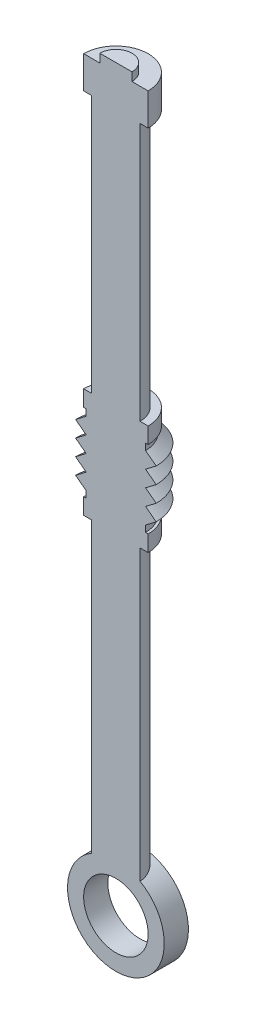
ISO-10303-21;
HEADER;
FILE_DESCRIPTION(('STEP AP214'),'2;1');
FILE_NAME('part.step','',(''),(''),'','','');
FILE_SCHEMA(('AUTOMOTIVE_DESIGN { 1 0 10303 214 1 1 1 1 }'));
ENDSEC;
DATA;
#1=APPLICATION_CONTEXT('core data for automotive mechanical design processes');
#2=APPLICATION_PROTOCOL_DEFINITION('international standard','automotive_design',2000,#1);
#3=PRODUCT_CONTEXT('',#1,'mechanical');
#4=PRODUCT('Part','Part','',(#3));
#5=PRODUCT_RELATED_PRODUCT_CATEGORY('part','',(#4));
#6=PRODUCT_DEFINITION_FORMATION('','',#4);
#7=PRODUCT_DEFINITION_CONTEXT('part definition',#1,'design');
#8=PRODUCT_DEFINITION('design','',#6,#7);
#9=PRODUCT_DEFINITION_SHAPE('','',#8);
#10=(LENGTH_UNIT() NAMED_UNIT(*) SI_UNIT(.MILLI.,.METRE.));
#11=(NAMED_UNIT(*) PLANE_ANGLE_UNIT() SI_UNIT($,.RADIAN.));
#12=(NAMED_UNIT(*) SI_UNIT($,.STERADIAN.) SOLID_ANGLE_UNIT());
#13=UNCERTAINTY_MEASURE_WITH_UNIT(LENGTH_MEASURE(1.E-05),#10,'distance_accuracy_value','');
#14=(GEOMETRIC_REPRESENTATION_CONTEXT(3) GLOBAL_UNCERTAINTY_ASSIGNED_CONTEXT((#13)) GLOBAL_UNIT_ASSIGNED_CONTEXT((#10,
#11,#12)) REPRESENTATION_CONTEXT('',''));
#15=CARTESIAN_POINT('',(0.,0.,0.));
#16=DIRECTION('',(0.,0.,1.));
#17=DIRECTION('',(1.,0.,0.));
#18=AXIS2_PLACEMENT_3D('',#15,#16,#17);
#19=CARTESIAN_POINT('',(0.,0.,-2.38125));
#20=DIRECTION('',(0.,0.,1.));
#21=DIRECTION('',(1.,0.,0.));
#22=AXIS2_PLACEMENT_3D('',#19,#20,#21);
#23=CYLINDRICAL_SURFACE('',#22,4.7625);
#24=CARTESIAN_POINT('',(0.,4.7625,2.38125));
#25=CARTESIAN_POINT('',(-0.125183914923426,4.76249216616824,2.38124079022415));
#26=CARTESIAN_POINT('',(-0.250522391801445,4.75751079676351,2.37131965241024));
#27=CARTESIAN_POINT('',(-0.497492135528296,4.73807236179371,2.33207069034315));
#28=CARTESIAN_POINT('',(-0.61911590225731,4.72359730146256,2.30270601091892));
#29=CARTESIAN_POINT('',(-0.854710283828683,4.68668758103659,2.2260071468603));
#30=CARTESIAN_POINT('',(-0.968708640458038,4.66428387601664,2.17874279663695));
#31=CARTESIAN_POINT('',(-1.18698797780686,4.6135713226785,2.06794748374516));
#32=CARTESIAN_POINT('',(-1.29126972381591,4.58526293998811,2.0044178036293));
#33=CARTESIAN_POINT('',(-1.49425297381025,4.52333339410727,1.8585245421104));
#34=CARTESIAN_POINT('',(-1.59223521685329,4.48949442770284,1.77525406928113));
#35=CARTESIAN_POINT('',(-1.77350605772424,4.42102804302336,1.59419572957401));
#36=CARTESIAN_POINT('',(-1.85678345855757,4.3864000463997,1.49639690352979));
#37=CARTESIAN_POINT('',(-2.01275632468803,4.31718127493204,1.27996152334087));
#38=CARTESIAN_POINT('',(-2.08413032991234,4.2828016396047,1.16029716565166));
#39=CARTESIAN_POINT('',(-2.2054380906532,4.22162236963736,0.90876278134485));
#40=CARTESIAN_POINT('',(-2.25538716198478,4.19481732492304,0.776901556021107));
#41=CARTESIAN_POINT('',(-2.32917787787114,4.1542779588081,0.512766217674418));
#42=CARTESIAN_POINT('',(-2.35440344714868,4.13985721707925,0.380989398503949));
#43=CARTESIAN_POINT('',(-2.38226677784078,4.12389375440723,0.114350392548179));
#44=CARTESIAN_POINT('',(-2.38492686044446,4.12233830748904,-0.0205086129467756));
#45=CARTESIAN_POINT('',(-2.36859910257368,4.13172902674897,-0.272143595403314));
#46=CARTESIAN_POINT('',(-2.35216198239562,4.14120243470123,-0.389153474350517));
#47=CARTESIAN_POINT('',(-2.30252551556825,4.16900269672528,-0.618462796693928));
#48=CARTESIAN_POINT('',(-2.26932082940667,4.1873323709318,-0.730760727258112));
#49=CARTESIAN_POINT('',(-2.18648703954377,4.23118303207826,-0.95066437192215));
#50=CARTESIAN_POINT('',(-2.13649337856986,4.25686158081143,-1.05809986210871));
#51=CARTESIAN_POINT('',(-2.02178051875954,4.31252481445096,-1.26357290922991));
#52=CARTESIAN_POINT('',(-1.95705470557847,4.3425114313283,-1.3616062166477));
#53=CARTESIAN_POINT('',(-1.80514479326104,4.40800707257198,-1.55857873309482));
#54=CARTESIAN_POINT('',(-1.71615367899184,4.44373421251251,-1.65605668020323));
#55=CARTESIAN_POINT('',(-1.5229417218779,4.51360277984095,-1.83531371551958));
#56=CARTESIAN_POINT('',(-1.41871364221752,4.54774344351895,-1.91708530103068));
#57=CARTESIAN_POINT('',(-1.19185492951209,4.61252857217558,-2.06617648032704));
#58=CARTESIAN_POINT('',(-1.06859448999609,4.6429370603578,-2.13264862501142));
#59=CARTESIAN_POINT('',(-0.810735175632698,4.69482204419958,-2.24336855040867));
#60=CARTESIAN_POINT('',(-0.676145403481687,4.71630562984336,-2.28763397806736));
#61=CARTESIAN_POINT('',(-0.411400208267049,4.74641069721793,-2.34904455510034));
#62=CARTESIAN_POINT('',(-0.281800769618209,4.75595009329994,-2.36813225512202));
#63=CARTESIAN_POINT('',(-0.0209064223793881,4.7642386329949,-2.384737891014));
#64=CARTESIAN_POINT('',(0.110387653565244,4.7629928883014,-2.38226604517899));
#65=CARTESIAN_POINT('',(0.360123514541608,4.75038401553492,-2.35694532320286));
#66=CARTESIAN_POINT('',(0.478772715418814,4.73981253794951,-2.33569065643669));
#67=CARTESIAN_POINT('',(0.710581412294078,4.71064045443463,-2.27590809129975));
#68=CARTESIAN_POINT('',(0.823740301552203,4.69203896333817,-2.23737828863266));
#69=CARTESIAN_POINT('',(1.04510349887023,4.64782498678607,-2.14312865180629));
#70=CARTESIAN_POINT('',(1.15307363286889,4.62202724713937,-2.08694881191042));
#71=CARTESIAN_POINT('',(1.35841111754757,4.56590338843347,-1.95951268074179));
#72=CARTESIAN_POINT('',(1.45577392465991,4.53557534193758,-1.88824996699537));
#73=CARTESIAN_POINT('',(1.64727181011511,4.46980202056836,-1.72459548718051));
#74=CARTESIAN_POINT('',(1.7401510102877,4.4341466953364,-1.63081604451219));
#75=CARTESIAN_POINT('',(1.90942036468315,4.36393570018444,-1.42892823352271));
#76=CARTESIAN_POINT('',(1.98579911229707,4.32938080496145,-1.32081003575388));
#77=CARTESIAN_POINT('',(2.12337947127906,4.2636565144193,-1.0866985484896));
#78=CARTESIAN_POINT('',(2.18366696159152,4.23273211084819,-0.960093172570528));
#79=CARTESIAN_POINT('',(2.28143472953946,4.18085759649541,-0.696491651629047));
#80=CARTESIAN_POINT('',(2.3189443944635,4.15989464137303,-0.559509152757374));
#81=CARTESIAN_POINT('',(2.36663314232661,4.13293324320619,-0.29310753161418));
#82=CARTESIAN_POINT('',(2.37909019428893,4.12569144386626,-0.164224683502319));
#83=CARTESIAN_POINT('',(2.3828910522584,4.12350000729882,0.0939333281807322));
#84=CARTESIAN_POINT('',(2.37424400991589,4.12854504196533,0.223208297429794));
#85=CARTESIAN_POINT('',(2.33821157512933,4.14903909044237,0.465495089724903));
#86=CARTESIAN_POINT('',(2.31268975773311,4.16345118862044,0.578883000588989));
#87=CARTESIAN_POINT('',(2.24593636258125,4.19983482171594,0.799643078320496));
#88=CARTESIAN_POINT('',(2.20469973139119,4.22180878809312,0.907013297317141));
#89=CARTESIAN_POINT('',(2.10458608148048,4.27264188427817,1.12067545046553));
#90=CARTESIAN_POINT('',(2.04471002356456,4.30186440868521,1.2264102837776));
#91=CARTESIAN_POINT('',(1.91012262489561,4.36329131541278,1.42702239668615));
#92=CARTESIAN_POINT('',(1.83540356597009,4.39549724439656,1.52189398690387));
#93=CARTESIAN_POINT('',(1.66259405491127,4.46394665051477,1.71007598397153));
#94=CARTESIAN_POINT('',(1.56276696401922,4.50020523168019,1.80179601937323));
#95=CARTESIAN_POINT('',(1.34816645613201,4.56908865882827,1.96753719658021));
#96=CARTESIAN_POINT('',(1.23338503411081,4.60171154114937,2.0415487984721));
#97=CARTESIAN_POINT('',(0.990398154568059,4.66006004858537,2.16988737295861));
#98=CARTESIAN_POINT('',(0.862103521645129,4.68573527644208,2.22407146731469));
#99=CARTESIAN_POINT('',(0.663253095567626,4.71657007779491,2.28808012549976));
#100=CARTESIAN_POINT('',(0.595951068853118,4.72556504162985,2.30653151659672));
#101=CARTESIAN_POINT('',(0.459699357941892,4.74075563729533,2.33749781582299));
#102=CARTESIAN_POINT('',(0.390750707345512,4.74695297899059,2.35001635025922));
#103=CARTESIAN_POINT('',(0.268146547102141,4.75524386229739,2.36671244235111));
#104=CARTESIAN_POINT('',(0.21470159582656,4.75795932264298,2.37215832704609));
#105=CARTESIAN_POINT('',(0.107513940854614,4.761589098815,2.37942913381609));
#106=CARTESIAN_POINT('',(0.0537712289809023,4.76250336492721,2.38125395594727));
#107=CARTESIAN_POINT('',(0.,4.7625,2.38125));
#108=B_SPLINE_CURVE_WITH_KNOTS('',3,(#24,#25,#26,#27,#28,#29,#30,#31,#32,#33,#34,#35,#36,#37,
#38,#39,#40,#41,#42,#43,#44,#45,#46,#47,#48,#49,#50,#51,#52,#53,#54,#55,#56,#57,#58,#59,#60,#61,
#62,#63,#64,#65,#66,#67,#68,#69,#70,#71,#72,#73,#74,#75,#76,#77,#78,#79,#80,#81,#82,#83,#84,#85,
#86,#87,#88,#89,#90,#91,#92,#93,#94,#95,#96,#97,#98,#99,#100,#101,#102,#103,#104,#105,#106,
#107),.UNSPECIFIED.,.T.,.F.,(4,2,2,2,2,2,2,2,2,2,2,2,2,2,2,2,2,2,2,2,2,2,2,2,2,2,2,2,2,2,2,2,2,
2,2,2,2,2,2,2,2,4),(0.,0.375342762982071,0.751399031495027,1.12600300776604,1.50057745488486,
1.89781281294745,2.29534935341367,2.7237148606323,3.15177363432781,3.55420641408922,
3.9562410713973,4.31019852674695,4.66426876848022,5.0265863440121,5.38906691250903,
5.79750891551298,6.20614554263122,6.63375821648137,7.06103054022366,7.45291460434892,
7.84461294242952,8.20595196117703,8.56733082133655,8.93904238416433,9.31091254594483,
9.71930072847022,10.127970328905,10.5564308689761,10.984337440701,11.3711666349163,
11.7578281130277,12.1076544640509,12.4575934042726,12.8310431270806,13.2046875497327,
13.6237323431551,14.0430023792659,14.4652368253627,14.6760580296016,14.8867502080478,
15.0479696796956,15.2091936010515),.UNSPECIFIED.);
#109=CARTESIAN_POINT('',(0.,4.7625,-2.38125));
#110=VERTEX_POINT('',#109);
#111=CARTESIAN_POINT('',(2.38125,4.12444598552338,0.));
#112=VERTEX_POINT('',#111);
#113=EDGE_CURVE('E269',#110,#112,#108,.T.);
#114=ORIENTED_EDGE('',*,*,#113,.T.);
#115=CARTESIAN_POINT('',(0.,0.,0.));
#116=DIRECTION('',(0.,0.,1.));
#117=DIRECTION('',(1.,0.,0.));
#118=AXIS2_PLACEMENT_3D('',#115,#116,#117);
#119=CIRCLE('',#118,4.7625);
#120=CARTESIAN_POINT('',(-2.38125,4.12444598552338,0.));
#121=VERTEX_POINT('',#120);
#122=EDGE_CURVE('E382',#112,#121,#119,.F.);
#123=ORIENTED_EDGE('',*,*,#122,.T.);
#124=EDGE_CURVE('E54',#121,#110,#108,.T.);
#125=ORIENTED_EDGE('',*,*,#124,.T.);
#126=CARTESIAN_POINT('',(0.,0.,-2.38125));
#127=DIRECTION('',(0.,0.,1.));
#128=DIRECTION('',(1.,0.,0.));
#129=AXIS2_PLACEMENT_3D('',#126,#127,#128);
#130=CIRCLE('',#129,4.7625);
#131=EDGE_CURVE('E40',#110,#110,#130,.T.);
#132=ORIENTED_EDGE('',*,*,#131,.T.);
#133=EDGE_LOOP('',(#114,#123,#125,#132));
#134=FACE_BOUND('',#133,.T.);
#135=ADVANCED_FACE('F33',(#134),#23,.T.);
#136=CARTESIAN_POINT('',(0.,0.,-2.38125));
#137=DIRECTION('',(0.,0.,1.));
#138=DIRECTION('',(1.,0.,0.));
#139=AXIS2_PLACEMENT_3D('',#136,#137,#138);
#140=CYLINDRICAL_SURFACE('',#139,3.175);
#141=CARTESIAN_POINT('',(0.,0.,-2.38125));
#142=DIRECTION('',(0.,0.,1.));
#143=DIRECTION('',(1.,0.,0.));
#144=AXIS2_PLACEMENT_3D('',#141,#142,#143);
#145=CIRCLE('',#144,3.175);
#146=CARTESIAN_POINT('',(3.175,0.,-2.38125));
#147=VERTEX_POINT('',#146);
#148=EDGE_CURVE('E276',#147,#147,#145,.T.);
#149=CARTESIAN_POINT('',(0.,0.,0.));
#150=DIRECTION('',(0.,0.,1.));
#151=DIRECTION('',(1.,0.,0.));
#152=AXIS2_PLACEMENT_3D('',#149,#150,#151);
#153=CIRCLE('',#152,3.175);
#154=CARTESIAN_POINT('',(3.175,0.,0.));
#155=VERTEX_POINT('',#154);
#156=EDGE_CURVE('E210',#155,#155,#153,.F.);
#157=CARTESIAN_POINT('',(3.175,0.,-2.38125));
#158=CARTESIAN_POINT('',(3.175,0.,-2.3564453125));
#159=CARTESIAN_POINT('',(3.175,0.,-2.331640625));
#160=CARTESIAN_POINT('',(3.175,0.,-2.28203125));
#161=CARTESIAN_POINT('',(3.175,0.,-2.2572265625));
#162=CARTESIAN_POINT('',(3.175,0.,-2.2076171875));
#163=CARTESIAN_POINT('',(3.175,0.,-2.1828125));
#164=CARTESIAN_POINT('',(3.175,0.,-2.133203125));
#165=CARTESIAN_POINT('',(3.175,0.,-2.1083984375));
#166=CARTESIAN_POINT('',(3.175,0.,-2.0587890625));
#167=CARTESIAN_POINT('',(3.175,0.,-2.033984375));
#168=CARTESIAN_POINT('',(3.175,0.,-1.984375));
#169=CARTESIAN_POINT('',(3.175,0.,-1.9595703125));
#170=CARTESIAN_POINT('',(3.175,0.,-1.9099609375));
#171=CARTESIAN_POINT('',(3.175,0.,-1.88515625));
#172=CARTESIAN_POINT('',(3.175,0.,-1.835546875));
#173=CARTESIAN_POINT('',(3.175,0.,-1.8107421875));
#174=CARTESIAN_POINT('',(3.175,0.,-1.7611328125));
#175=CARTESIAN_POINT('',(3.175,0.,-1.736328125));
#176=CARTESIAN_POINT('',(3.175,0.,-1.68671875));
#177=CARTESIAN_POINT('',(3.175,0.,-1.6619140625));
#178=CARTESIAN_POINT('',(3.175,0.,-1.6123046875));
#179=CARTESIAN_POINT('',(3.175,0.,-1.5875));
#180=CARTESIAN_POINT('',(3.175,0.,-1.537890625));
#181=CARTESIAN_POINT('',(3.175,0.,-1.5130859375));
#182=CARTESIAN_POINT('',(3.175,0.,-1.4634765625));
#183=CARTESIAN_POINT('',(3.175,0.,-1.438671875));
#184=CARTESIAN_POINT('',(3.175,0.,-1.3890625));
#185=CARTESIAN_POINT('',(3.175,0.,-1.3642578125));
#186=CARTESIAN_POINT('',(3.175,0.,-1.3146484375));
#187=CARTESIAN_POINT('',(3.175,0.,-1.28984375));
#188=CARTESIAN_POINT('',(3.175,0.,-1.240234375));
#189=CARTESIAN_POINT('',(3.175,0.,-1.2154296875));
#190=CARTESIAN_POINT('',(3.175,0.,-1.1658203125));
#191=CARTESIAN_POINT('',(3.175,0.,-1.141015625));
#192=CARTESIAN_POINT('',(3.175,0.,-1.09140625));
#193=CARTESIAN_POINT('',(3.175,0.,-1.0666015625));
#194=CARTESIAN_POINT('',(3.175,0.,-1.0169921875));
#195=CARTESIAN_POINT('',(3.175,0.,-0.9921875));
#196=CARTESIAN_POINT('',(3.175,0.,-0.942578125));
#197=CARTESIAN_POINT('',(3.175,0.,-0.9177734375));
#198=CARTESIAN_POINT('',(3.175,0.,-0.8681640625));
#199=CARTESIAN_POINT('',(3.175,0.,-0.843359375));
#200=CARTESIAN_POINT('',(3.175,0.,-0.79375));
#201=CARTESIAN_POINT('',(3.175,0.,-0.7689453125));
#202=CARTESIAN_POINT('',(3.175,0.,-0.7193359375));
#203=CARTESIAN_POINT('',(3.175,0.,-0.69453125));
#204=CARTESIAN_POINT('',(3.175,0.,-0.644921875));
#205=CARTESIAN_POINT('',(3.175,0.,-0.6201171875));
#206=CARTESIAN_POINT('',(3.175,0.,-0.5705078125));
#207=CARTESIAN_POINT('',(3.175,0.,-0.545703125));
#208=CARTESIAN_POINT('',(3.175,0.,-0.49609375));
#209=CARTESIAN_POINT('',(3.175,0.,-0.4712890625));
#210=CARTESIAN_POINT('',(3.175,0.,-0.4216796875));
#211=CARTESIAN_POINT('',(3.175,0.,-0.396875));
#212=CARTESIAN_POINT('',(3.175,0.,-0.347265625));
#213=CARTESIAN_POINT('',(3.175,0.,-0.3224609375));
#214=CARTESIAN_POINT('',(3.175,0.,-0.2728515625));
#215=CARTESIAN_POINT('',(3.175,0.,-0.248046875));
#216=CARTESIAN_POINT('',(3.175,0.,-0.1984375));
#217=CARTESIAN_POINT('',(3.175,0.,-0.1736328125));
#218=CARTESIAN_POINT('',(3.175,0.,-0.1240234375));
#219=CARTESIAN_POINT('',(3.175,0.,-0.0992187500000001));
#220=CARTESIAN_POINT('',(3.175,0.,-0.049609375));
#221=CARTESIAN_POINT('',(3.175,0.,-0.0248046875));
#222=CARTESIAN_POINT('',(3.175,0.,0.));
#223=B_SPLINE_CURVE_WITH_KNOTS('',3,(#157,#158,#159,#160,#161,#162,#163,#164,#165,#166,#167,
#168,#169,#170,#171,#172,#173,#174,#175,#176,#177,#178,#179,#180,#181,#182,#183,#184,#185,#186,
#187,#188,#189,#190,#191,#192,#193,#194,#195,#196,#197,#198,#199,#200,#201,#202,#203,#204,#205,
#206,#207,#208,#209,#210,#211,#212,#213,#214,#215,#216,#217,#218,#219,#220,#221,#222),
.UNSPECIFIED.,.F.,.F.,(4,2,2,2,2,2,2,2,2,2,2,2,2,2,2,2,2,2,2,2,2,2,2,2,2,2,2,2,2,2,2,2,4),(0.,
0.0744140624999996,0.148828125,0.2232421875,0.29765625,0.3720703125,0.446484375,0.5208984375,
0.5953125,0.6697265625,0.744140625,0.8185546875,0.89296875,0.9673828125,1.041796875,
1.1162109375,1.190625,1.2650390625,1.339453125,1.4138671875,1.48828125,1.5626953125,1.637109375,
1.7115234375,1.7859375,1.8603515625,1.934765625,2.0091796875,2.08359375,2.1580078125,
2.232421875,2.3068359375,2.38125),.UNSPECIFIED.);
#224=EDGE_CURVE('BSEAM375',#147,#155,#223,.T.);
#225=ORIENTED_EDGE('',*,*,#148,.F.);
#226=ORIENTED_EDGE('',*,*,#156,.F.);
#227=ORIENTED_EDGE('',*,*,#224,.T.);
#228=ORIENTED_EDGE('',*,*,#224,.F.);
#229=EDGE_LOOP('',(#225,#227,#226,#228));
#230=FACE_BOUND('',#229,.T.);
#231=ADVANCED_FACE('F375',(#230),#140,.F.);
#232=CARTESIAN_POINT('',(0.,33.3375,0.));
#233=DIRECTION('',(0.,-1.,0.));
#234=DIRECTION('',(0.,0.,-1.));
#235=AXIS2_PLACEMENT_3D('',#232,#233,#234);
#236=CYLINDRICAL_SURFACE('',#235,2.38125);
#237=DIRECTION('',(0.,-1.,0.));
#238=VECTOR('',#237,1.);
#239=CARTESIAN_POINT('',(-2.38125,33.3375,0.));
#240=LINE('',#239,#238);
#241=CARTESIAN_POINT('',(-2.38125,32.54375,0.));
#242=VERTEX_POINT('',#241);
#243=EDGE_CURVE('E391',#242,#121,#240,.T.);
#244=ORIENTED_EDGE('',*,*,#243,.F.);
#245=CARTESIAN_POINT('',(0.,32.54375,0.));
#246=DIRECTION('',(0.,-1.,0.));
#247=DIRECTION('',(0.,0.,-1.));
#248=AXIS2_PLACEMENT_3D('',#245,#246,#247);
#249=CIRCLE('',#248,2.38125);
#250=CARTESIAN_POINT('',(2.38125,32.54375,0.));
#251=VERTEX_POINT('',#250);
#252=EDGE_CURVE('E268',#242,#251,#249,.T.);
#253=ORIENTED_EDGE('',*,*,#252,.T.);
#254=DIRECTION('',(0.,-1.,0.));
#255=VECTOR('',#254,1.);
#256=CARTESIAN_POINT('',(2.38125,33.3375,0.));
#257=LINE('',#256,#255);
#258=EDGE_CURVE('E388',#112,#251,#257,.F.);
#259=ORIENTED_EDGE('',*,*,#258,.F.);
#260=ORIENTED_EDGE('',*,*,#113,.F.);
#261=ORIENTED_EDGE('',*,*,#124,.F.);
#262=EDGE_LOOP('',(#244,#253,#259,#260,#261));
#263=FACE_BOUND('',#262,.T.);
#264=ADVANCED_FACE('F286',(#263),#236,.T.);
#265=CARTESIAN_POINT('',(0.,32.54375,0.));
#266=DIRECTION('',(0.,-1.,0.));
#267=DIRECTION('',(0.,0.,-1.));
#268=AXIS2_PLACEMENT_3D('',#265,#266,#267);
#269=CYLINDRICAL_SURFACE('',#268,3.175);
#270=CARTESIAN_POINT('',(0.,32.54375,0.));
#271=DIRECTION('',(0.,-1.,0.));
#272=DIRECTION('',(0.,0.,-1.));
#273=AXIS2_PLACEMENT_3D('',#270,#271,#272);
#274=CIRCLE('',#273,3.175);
#275=CARTESIAN_POINT('',(-3.175,32.54375,0.));
#276=VERTEX_POINT('',#275);
#277=CARTESIAN_POINT('',(3.175,32.54375,0.));
#278=VERTEX_POINT('',#277);
#279=EDGE_CURVE('E265',#276,#278,#274,.T.);
#280=ORIENTED_EDGE('',*,*,#279,.F.);
#281=DIRECTION('',(0.,-1.,0.));
#282=VECTOR('',#281,1.);
#283=CARTESIAN_POINT('',(-3.175,32.54375,0.));
#284=LINE('',#283,#282);
#285=CARTESIAN_POINT('',(-3.175,34.13125,0.));
#286=VERTEX_POINT('',#285);
#287=EDGE_CURVE('E402',#276,#286,#284,.F.);
#288=ORIENTED_EDGE('',*,*,#287,.T.);
#289=CARTESIAN_POINT('',(0.,34.13125,0.));
#290=DIRECTION('',(0.,-1.,0.));
#291=DIRECTION('',(0.,0.,-1.));
#292=AXIS2_PLACEMENT_3D('',#289,#290,#291);
#293=CIRCLE('',#292,3.175);
#294=CARTESIAN_POINT('',(3.175,34.13125,0.));
#295=VERTEX_POINT('',#294);
#296=EDGE_CURVE('E221',#286,#295,#293,.T.);
#297=ORIENTED_EDGE('',*,*,#296,.T.);
#298=DIRECTION('',(0.,-1.,0.));
#299=VECTOR('',#298,1.);
#300=CARTESIAN_POINT('',(3.175,32.54375,0.));
#301=LINE('',#300,#299);
#302=EDGE_CURVE('E405',#295,#278,#301,.T.);
#303=ORIENTED_EDGE('',*,*,#302,.T.);
#304=EDGE_LOOP('',(#280,#288,#297,#303));
#305=FACE_BOUND('',#304,.T.);
#306=ADVANCED_FACE('F282',(#305),#269,.T.);
#307=CARTESIAN_POINT('',(0.,32.54375,0.));
#308=DIRECTION('',(0.,-1.,0.));
#309=DIRECTION('',(0.,0.,-1.));
#310=AXIS2_PLACEMENT_3D('',#307,#308,#309);
#311=PLANE('',#310);
#312=ORIENTED_EDGE('',*,*,#279,.T.);
#313=DIRECTION('',(-1.,0.,0.));
#314=VECTOR('',#313,1.);
#315=CARTESIAN_POINT('',(0.,32.54375,0.));
#316=LINE('',#315,#314);
#317=EDGE_CURVE('E392',#278,#251,#316,.T.);
#318=ORIENTED_EDGE('',*,*,#317,.T.);
#319=ORIENTED_EDGE('',*,*,#252,.F.);
#320=EDGE_CURVE('E395',#242,#276,#316,.T.);
#321=ORIENTED_EDGE('',*,*,#320,.T.);
#322=EDGE_LOOP('',(#312,#318,#319,#321));
#323=FACE_BOUND('',#322,.T.);
#324=ADVANCED_FACE('F285',(#323),#311,.T.);
#325=CARTESIAN_POINT('',(0.,43.33875,0.));
#326=DIRECTION('',(0.,1.,0.));
#327=DIRECTION('',(0.,0.,1.));
#328=AXIS2_PLACEMENT_3D('',#325,#326,#327);
#329=PLANE('',#328);
#330=CARTESIAN_POINT('',(0.,43.33875,0.));
#331=DIRECTION('',(0.,-1.,0.));
#332=DIRECTION('',(0.,0.,-1.));
#333=AXIS2_PLACEMENT_3D('',#330,#331,#332);
#334=CIRCLE('',#333,3.175);
#335=CARTESIAN_POINT('',(-3.175,43.33875,0.));
#336=VERTEX_POINT('',#335);
#337=CARTESIAN_POINT('',(3.175,43.33875,0.));
#338=VERTEX_POINT('',#337);
#339=EDGE_CURVE('E262',#336,#338,#334,.T.);
#340=ORIENTED_EDGE('',*,*,#339,.F.);
#341=DIRECTION('',(1.,0.,0.));
#342=VECTOR('',#341,1.);
#343=CARTESIAN_POINT('',(0.,43.33875,0.));
#344=LINE('',#343,#342);
#345=CARTESIAN_POINT('',(-2.38125,43.33875,0.));
#346=VERTEX_POINT('',#345);
#347=EDGE_CURVE('E481',#336,#346,#344,.T.);
#348=ORIENTED_EDGE('',*,*,#347,.T.);
#349=CARTESIAN_POINT('',(0.,43.33875,0.));
#350=DIRECTION('',(0.,1.,0.));
#351=DIRECTION('',(0.,0.,1.));
#352=AXIS2_PLACEMENT_3D('',#349,#350,#351);
#353=CIRCLE('',#352,2.38125);
#354=CARTESIAN_POINT('',(2.38125,43.33875,0.));
#355=VERTEX_POINT('',#354);
#356=EDGE_CURVE('E216',#355,#346,#353,.T.);
#357=ORIENTED_EDGE('',*,*,#356,.F.);
#358=EDGE_CURVE('E482',#355,#338,#344,.T.);
#359=ORIENTED_EDGE('',*,*,#358,.T.);
#360=EDGE_LOOP('',(#340,#348,#357,#359));
#361=FACE_BOUND('',#360,.T.);
#362=ADVANCED_FACE('F290',(#361),#329,.T.);
#363=CARTESIAN_POINT('',(0.,32.54375,0.));
#364=DIRECTION('',(0.,-1.,0.));
#365=DIRECTION('',(0.,0.,-1.));
#366=AXIS2_PLACEMENT_3D('',#363,#364,#365);
#367=CYLINDRICAL_SURFACE('',#366,3.175);
#368=CARTESIAN_POINT('',(0.,41.75125,0.));
#369=DIRECTION('',(0.,-1.,0.));
#370=DIRECTION('',(0.,0.,-1.));
#371=AXIS2_PLACEMENT_3D('',#368,#369,#370);
#372=CIRCLE('',#371,3.175);
#373=CARTESIAN_POINT('',(-3.175,41.75125,0.));
#374=VERTEX_POINT('',#373);
#375=CARTESIAN_POINT('',(3.175,41.75125,0.));
#376=VERTEX_POINT('',#375);
#377=EDGE_CURVE('E259',#374,#376,#372,.T.);
#378=ORIENTED_EDGE('',*,*,#377,.F.);
#379=DIRECTION('',(0.,-1.,0.));
#380=VECTOR('',#379,1.);
#381=CARTESIAN_POINT('',(-3.175,32.54375,0.));
#382=LINE('',#381,#380);
#383=EDGE_CURVE('E475',#374,#336,#382,.F.);
#384=ORIENTED_EDGE('',*,*,#383,.T.);
#385=ORIENTED_EDGE('',*,*,#339,.T.);
#386=DIRECTION('',(0.,-1.,0.));
#387=VECTOR('',#386,1.);
#388=CARTESIAN_POINT('',(3.175,32.54375,0.));
#389=LINE('',#388,#387);
#390=EDGE_CURVE('E478',#338,#376,#389,.T.);
#391=ORIENTED_EDGE('',*,*,#390,.T.);
#392=EDGE_LOOP('',(#378,#384,#385,#391));
#393=FACE_BOUND('',#392,.T.);
#394=ADVANCED_FACE('F294',(#393),#367,.T.);
#395=CARTESIAN_POINT('',(0.,41.75125,0.));
#396=DIRECTION('',(0.,-1.,0.));
#397=DIRECTION('',(0.,0.,-1.));
#398=AXIS2_PLACEMENT_3D('',#395,#396,#397);
#399=PLANE('',#398);
#400=ORIENTED_EDGE('',*,*,#377,.T.);
#401=DIRECTION('',(-1.,0.,0.));
#402=VECTOR('',#401,1.);
#403=CARTESIAN_POINT('',(0.,41.75125,0.));
#404=LINE('',#403,#402);
#405=CARTESIAN_POINT('',(2.921,41.75125,0.));
#406=VERTEX_POINT('',#405);
#407=EDGE_CURVE('E471',#376,#406,#404,.T.);
#408=ORIENTED_EDGE('',*,*,#407,.T.);
#409=CARTESIAN_POINT('',(0.,41.75125,0.));
#410=DIRECTION('',(0.,-1.,0.));
#411=DIRECTION('',(0.,0.,-1.));
#412=AXIS2_PLACEMENT_3D('',#409,#410,#411);
#413=CIRCLE('',#412,2.921);
#414=CARTESIAN_POINT('',(-2.921,41.75125,0.));
#415=VERTEX_POINT('',#414);
#416=EDGE_CURVE('E256',#415,#406,#413,.T.);
#417=ORIENTED_EDGE('',*,*,#416,.F.);
#418=EDGE_CURVE('E472',#415,#374,#404,.T.);
#419=ORIENTED_EDGE('',*,*,#418,.T.);
#420=EDGE_LOOP('',(#400,#408,#417,#419));
#421=FACE_BOUND('',#420,.T.);
#422=ADVANCED_FACE('F298',(#421),#399,.T.);
#423=CARTESIAN_POINT('',(0.,32.54375,0.));
#424=DIRECTION('',(0.,-1.,0.));
#425=DIRECTION('',(0.,0.,-1.));
#426=AXIS2_PLACEMENT_3D('',#423,#424,#425);
#427=CYLINDRICAL_SURFACE('',#426,2.921);
#428=CARTESIAN_POINT('',(0.,41.11625,0.));
#429=DIRECTION('',(0.,-1.,0.));
#430=DIRECTION('',(0.,0.,-1.));
#431=AXIS2_PLACEMENT_3D('',#428,#429,#430);
#432=CIRCLE('',#431,2.921);
#433=CARTESIAN_POINT('',(-2.921,41.11625,0.));
#434=VERTEX_POINT('',#433);
#435=CARTESIAN_POINT('',(2.921,41.11625,0.));
#436=VERTEX_POINT('',#435);
#437=EDGE_CURVE('E253',#434,#436,#432,.T.);
#438=ORIENTED_EDGE('',*,*,#437,.F.);
#439=DIRECTION('',(0.,-1.,0.));
#440=VECTOR('',#439,1.);
#441=CARTESIAN_POINT('',(-2.921,32.54375,0.));
#442=LINE('',#441,#440);
#443=EDGE_CURVE('E465',#434,#415,#442,.F.);
#444=ORIENTED_EDGE('',*,*,#443,.T.);
#445=ORIENTED_EDGE('',*,*,#416,.T.);
#446=DIRECTION('',(0.,-1.,0.));
#447=VECTOR('',#446,1.);
#448=CARTESIAN_POINT('',(2.921,32.54375,0.));
#449=LINE('',#448,#447);
#450=EDGE_CURVE('E468',#406,#436,#449,.T.);
#451=ORIENTED_EDGE('',*,*,#450,.T.);
#452=EDGE_LOOP('',(#438,#444,#445,#451));
#453=FACE_BOUND('',#452,.T.);
#454=ADVANCED_FACE('F302',(#453),#427,.T.);
#455=CARTESIAN_POINT('',(0.,40.3225,0.));
#456=DIRECTION('',(0.,-1.,0.));
#457=DIRECTION('',(0.,0.,-1.));
#458=AXIS2_PLACEMENT_3D('',#455,#456,#457);
#459=CONICAL_SURFACE('',#458,3.96874999999999,0.922464337707633);
#460=CARTESIAN_POINT('',(0.,40.3225,0.));
#461=DIRECTION('',(0.,-1.,0.));
#462=DIRECTION('',(0.,0.,-1.));
#463=AXIS2_PLACEMENT_3D('',#460,#461,#462);
#464=CIRCLE('',#463,3.96874999999999);
#465=CARTESIAN_POINT('',(-3.96874999999999,40.3225,0.));
#466=VERTEX_POINT('',#465);
#467=CARTESIAN_POINT('',(3.96874999999999,40.3225,0.));
#468=VERTEX_POINT('',#467);
#469=EDGE_CURVE('E250',#466,#468,#464,.T.);
#470=ORIENTED_EDGE('',*,*,#469,.F.);
#471=DIRECTION('',(-0.797092148154008,-0.603857687995465,0.));
#472=VECTOR('',#471,1.);
#473=CARTESIAN_POINT('',(0.,43.3291287878788,0.));
#474=LINE('',#473,#472);
#475=EDGE_CURVE('E459',#466,#434,#474,.F.);
#476=ORIENTED_EDGE('',*,*,#475,.T.);
#477=ORIENTED_EDGE('',*,*,#437,.T.);
#478=DIRECTION('',(-0.797092148154008,0.603857687995465,0.));
#479=VECTOR('',#478,1.);
#480=CARTESIAN_POINT('',(0.,43.3291287878788,0.));
#481=LINE('',#480,#479);
#482=EDGE_CURVE('E462',#436,#468,#481,.F.);
#483=ORIENTED_EDGE('',*,*,#482,.T.);
#484=EDGE_LOOP('',(#470,#476,#477,#483));
#485=FACE_BOUND('',#484,.T.);
#486=ADVANCED_FACE('F306',(#485),#459,.T.);
#487=CARTESIAN_POINT('',(0.,39.52875,0.));
#488=DIRECTION('',(0.,1.,0.));
#489=DIRECTION('',(0.,0.,1.));
#490=AXIS2_PLACEMENT_3D('',#487,#488,#489);
#491=CONICAL_SURFACE('',#490,2.921,0.922464337707645);
#492=ORIENTED_EDGE('',*,*,#469,.T.);
#493=DIRECTION('',(0.797092148154016,0.603857687995455,0.));
#494=VECTOR('',#493,1.);
#495=CARTESIAN_POINT('',(0.,37.3158712121213,0.));
#496=LINE('',#495,#494);
#497=CARTESIAN_POINT('',(2.921,39.52875,0.));
#498=VERTEX_POINT('',#497);
#499=EDGE_CURVE('E453',#468,#498,#496,.F.);
#500=ORIENTED_EDGE('',*,*,#499,.T.);
#501=CARTESIAN_POINT('',(0.,39.52875,0.));
#502=DIRECTION('',(0.,-1.,0.));
#503=DIRECTION('',(0.,0.,-1.));
#504=AXIS2_PLACEMENT_3D('',#501,#502,#503);
#505=CIRCLE('',#504,2.921);
#506=CARTESIAN_POINT('',(-2.921,39.52875,0.));
#507=VERTEX_POINT('',#506);
#508=EDGE_CURVE('E247',#507,#498,#505,.T.);
#509=ORIENTED_EDGE('',*,*,#508,.F.);
#510=DIRECTION('',(0.797092148154016,-0.603857687995455,0.));
#511=VECTOR('',#510,1.);
#512=CARTESIAN_POINT('',(0.,37.3158712121213,0.));
#513=LINE('',#512,#511);
#514=EDGE_CURVE('E456',#507,#466,#513,.F.);
#515=ORIENTED_EDGE('',*,*,#514,.T.);
#516=EDGE_LOOP('',(#492,#500,#509,#515));
#517=FACE_BOUND('',#516,.T.);
#518=ADVANCED_FACE('F310',(#517),#491,.T.);
#519=CARTESIAN_POINT('',(0.,38.735,0.));
#520=DIRECTION('',(0.,-1.,0.));
#521=DIRECTION('',(0.,0.,-1.));
#522=AXIS2_PLACEMENT_3D('',#519,#520,#521);
#523=CONICAL_SURFACE('',#522,3.96875,0.922464337707637);
#524=CARTESIAN_POINT('',(0.,38.735,0.));
#525=DIRECTION('',(0.,-1.,0.));
#526=DIRECTION('',(0.,0.,-1.));
#527=AXIS2_PLACEMENT_3D('',#524,#525,#526);
#528=CIRCLE('',#527,3.96875);
#529=CARTESIAN_POINT('',(-3.96875,38.735,0.));
#530=VERTEX_POINT('',#529);
#531=CARTESIAN_POINT('',(3.96875,38.735,0.));
#532=VERTEX_POINT('',#531);
#533=EDGE_CURVE('E244',#530,#532,#528,.T.);
#534=ORIENTED_EDGE('',*,*,#533,.F.);
#535=DIRECTION('',(-0.797092148154011,-0.603857687995461,0.));
#536=VECTOR('',#535,1.);
#537=CARTESIAN_POINT('',(0.,41.7416287878788,0.));
#538=LINE('',#537,#536);
#539=EDGE_CURVE('E447',#530,#507,#538,.F.);
#540=ORIENTED_EDGE('',*,*,#539,.T.);
#541=ORIENTED_EDGE('',*,*,#508,.T.);
#542=DIRECTION('',(-0.797092148154011,0.603857687995461,0.));
#543=VECTOR('',#542,1.);
#544=CARTESIAN_POINT('',(0.,41.7416287878788,0.));
#545=LINE('',#544,#543);
#546=EDGE_CURVE('E450',#498,#532,#545,.F.);
#547=ORIENTED_EDGE('',*,*,#546,.T.);
#548=EDGE_LOOP('',(#534,#540,#541,#547));
#549=FACE_BOUND('',#548,.T.);
#550=ADVANCED_FACE('F314',(#549),#523,.T.);
#551=CARTESIAN_POINT('',(0.,37.94125,0.));
#552=DIRECTION('',(0.,1.,0.));
#553=DIRECTION('',(0.,0.,1.));
#554=AXIS2_PLACEMENT_3D('',#551,#552,#553);
#555=CONICAL_SURFACE('',#554,2.921,0.92246433770763);
#556=ORIENTED_EDGE('',*,*,#533,.T.);
#557=DIRECTION('',(0.797092148154007,0.603857687995467,0.));
#558=VECTOR('',#557,1.);
#559=CARTESIAN_POINT('',(0.,35.7283712121212,0.));
#560=LINE('',#559,#558);
#561=CARTESIAN_POINT('',(2.921,37.94125,0.));
#562=VERTEX_POINT('',#561);
#563=EDGE_CURVE('E441',#532,#562,#560,.F.);
#564=ORIENTED_EDGE('',*,*,#563,.T.);
#565=CARTESIAN_POINT('',(0.,37.94125,0.));
#566=DIRECTION('',(0.,-1.,0.));
#567=DIRECTION('',(0.,0.,-1.));
#568=AXIS2_PLACEMENT_3D('',#565,#566,#567);
#569=CIRCLE('',#568,2.921);
#570=CARTESIAN_POINT('',(-2.921,37.94125,0.));
#571=VERTEX_POINT('',#570);
#572=EDGE_CURVE('E241',#571,#562,#569,.T.);
#573=ORIENTED_EDGE('',*,*,#572,.F.);
#574=DIRECTION('',(0.797092148154007,-0.603857687995467,0.));
#575=VECTOR('',#574,1.);
#576=CARTESIAN_POINT('',(0.,35.7283712121212,0.));
#577=LINE('',#576,#575);
#578=EDGE_CURVE('E444',#571,#530,#577,.F.);
#579=ORIENTED_EDGE('',*,*,#578,.T.);
#580=EDGE_LOOP('',(#556,#564,#573,#579));
#581=FACE_BOUND('',#580,.T.);
#582=ADVANCED_FACE('F318',(#581),#555,.T.);
#583=CARTESIAN_POINT('',(0.,37.1475,0.));
#584=DIRECTION('',(0.,-1.,0.));
#585=DIRECTION('',(0.,0.,-1.));
#586=AXIS2_PLACEMENT_3D('',#583,#584,#585);
#587=CONICAL_SURFACE('',#586,3.96875,0.922464337707645);
#588=CARTESIAN_POINT('',(0.,37.1475,0.));
#589=DIRECTION('',(0.,-1.,0.));
#590=DIRECTION('',(0.,0.,-1.));
#591=AXIS2_PLACEMENT_3D('',#588,#589,#590);
#592=CIRCLE('',#591,3.96875);
#593=CARTESIAN_POINT('',(-3.96875,37.1475,0.));
#594=VERTEX_POINT('',#593);
#595=CARTESIAN_POINT('',(3.96875,37.1475,0.));
#596=VERTEX_POINT('',#595);
#597=EDGE_CURVE('E238',#594,#596,#592,.T.);
#598=ORIENTED_EDGE('',*,*,#597,.F.);
#599=DIRECTION('',(-0.797092148154016,-0.603857687995455,0.));
#600=VECTOR('',#599,1.);
#601=CARTESIAN_POINT('',(0.,40.1541287878787,0.));
#602=LINE('',#601,#600);
#603=EDGE_CURVE('E435',#594,#571,#602,.F.);
#604=ORIENTED_EDGE('',*,*,#603,.T.);
#605=ORIENTED_EDGE('',*,*,#572,.T.);
#606=DIRECTION('',(-0.797092148154016,0.603857687995455,0.));
#607=VECTOR('',#606,1.);
#608=CARTESIAN_POINT('',(0.,40.1541287878787,0.));
#609=LINE('',#608,#607);
#610=EDGE_CURVE('E438',#562,#596,#609,.F.);
#611=ORIENTED_EDGE('',*,*,#610,.T.);
#612=EDGE_LOOP('',(#598,#604,#605,#611));
#613=FACE_BOUND('',#612,.T.);
#614=ADVANCED_FACE('F322',(#613),#587,.T.);
#615=CARTESIAN_POINT('',(0.,36.35375,0.));
#616=DIRECTION('',(0.,1.,0.));
#617=DIRECTION('',(0.,0.,1.));
#618=AXIS2_PLACEMENT_3D('',#615,#616,#617);
#619=CONICAL_SURFACE('',#618,2.921,0.92246433770763);
#620=ORIENTED_EDGE('',*,*,#597,.T.);
#621=DIRECTION('',(0.797092148154007,0.603857687995467,0.));
#622=VECTOR('',#621,1.);
#623=CARTESIAN_POINT('',(0.,34.1408712121212,0.));
#624=LINE('',#623,#622);
#625=CARTESIAN_POINT('',(2.92099999999999,36.35375,0.));
#626=VERTEX_POINT('',#625);
#627=EDGE_CURVE('E429',#596,#626,#624,.F.);
#628=ORIENTED_EDGE('',*,*,#627,.T.);
#629=CARTESIAN_POINT('',(0.,36.35375,0.));
#630=DIRECTION('',(0.,-1.,0.));
#631=DIRECTION('',(0.,0.,-1.));
#632=AXIS2_PLACEMENT_3D('',#629,#630,#631);
#633=CIRCLE('',#632,2.921);
#634=CARTESIAN_POINT('',(-2.92099999999999,36.35375,0.));
#635=VERTEX_POINT('',#634);
#636=EDGE_CURVE('E235',#635,#626,#633,.T.);
#637=ORIENTED_EDGE('',*,*,#636,.F.);
#638=DIRECTION('',(0.797092148154007,-0.603857687995467,0.));
#639=VECTOR('',#638,1.);
#640=CARTESIAN_POINT('',(0.,34.1408712121212,0.));
#641=LINE('',#640,#639);
#642=EDGE_CURVE('E432',#635,#594,#641,.F.);
#643=ORIENTED_EDGE('',*,*,#642,.T.);
#644=EDGE_LOOP('',(#620,#628,#637,#643));
#645=FACE_BOUND('',#644,.T.);
#646=ADVANCED_FACE('F326',(#645),#619,.T.);
#647=CARTESIAN_POINT('',(0.,35.56,0.));
#648=DIRECTION('',(0.,-1.,0.));
#649=DIRECTION('',(0.,0.,-1.));
#650=AXIS2_PLACEMENT_3D('',#647,#648,#649);
#651=CONICAL_SURFACE('',#650,3.96875,0.92246433770764);
#652=CARTESIAN_POINT('',(0.,35.56,0.));
#653=DIRECTION('',(0.,-1.,0.));
#654=DIRECTION('',(0.,0.,-1.));
#655=AXIS2_PLACEMENT_3D('',#652,#653,#654);
#656=CIRCLE('',#655,3.96875);
#657=CARTESIAN_POINT('',(-3.96875,35.56,0.));
#658=VERTEX_POINT('',#657);
#659=CARTESIAN_POINT('',(3.96875,35.56,0.));
#660=VERTEX_POINT('',#659);
#661=EDGE_CURVE('E232',#658,#660,#656,.T.);
#662=ORIENTED_EDGE('',*,*,#661,.F.);
#663=DIRECTION('',(-0.797092148154013,-0.603857687995459,0.));
#664=VECTOR('',#663,1.);
#665=CARTESIAN_POINT('',(0.,38.5666287878788,0.));
#666=LINE('',#665,#664);
#667=EDGE_CURVE('E423',#658,#635,#666,.F.);
#668=ORIENTED_EDGE('',*,*,#667,.T.);
#669=ORIENTED_EDGE('',*,*,#636,.T.);
#670=DIRECTION('',(-0.797092148154013,0.603857687995459,0.));
#671=VECTOR('',#670,1.);
#672=CARTESIAN_POINT('',(0.,38.5666287878788,0.));
#673=LINE('',#672,#671);
#674=EDGE_CURVE('E426',#626,#660,#673,.F.);
#675=ORIENTED_EDGE('',*,*,#674,.T.);
#676=EDGE_LOOP('',(#662,#668,#669,#675));
#677=FACE_BOUND('',#676,.T.);
#678=ADVANCED_FACE('F330',(#677),#651,.T.);
#679=CARTESIAN_POINT('',(0.,34.76625,0.));
#680=DIRECTION('',(0.,1.,0.));
#681=DIRECTION('',(0.,0.,1.));
#682=AXIS2_PLACEMENT_3D('',#679,#680,#681);
#683=CONICAL_SURFACE('',#682,2.921,0.92246433770764);
#684=ORIENTED_EDGE('',*,*,#661,.T.);
#685=DIRECTION('',(0.797092148154013,0.603857687995459,0.));
#686=VECTOR('',#685,1.);
#687=CARTESIAN_POINT('',(0.,32.5533712121212,0.));
#688=LINE('',#687,#686);
#689=CARTESIAN_POINT('',(2.921,34.76625,0.));
#690=VERTEX_POINT('',#689);
#691=EDGE_CURVE('E417',#660,#690,#688,.F.);
#692=ORIENTED_EDGE('',*,*,#691,.T.);
#693=CARTESIAN_POINT('',(0.,34.76625,0.));
#694=DIRECTION('',(0.,-1.,0.));
#695=DIRECTION('',(0.,0.,-1.));
#696=AXIS2_PLACEMENT_3D('',#693,#694,#695);
#697=CIRCLE('',#696,2.921);
#698=CARTESIAN_POINT('',(-2.921,34.76625,0.));
#699=VERTEX_POINT('',#698);
#700=EDGE_CURVE('E229',#699,#690,#697,.T.);
#701=ORIENTED_EDGE('',*,*,#700,.F.);
#702=DIRECTION('',(0.797092148154013,-0.603857687995459,0.));
#703=VECTOR('',#702,1.);
#704=CARTESIAN_POINT('',(0.,32.5533712121212,0.));
#705=LINE('',#704,#703);
#706=EDGE_CURVE('E420',#699,#658,#705,.F.);
#707=ORIENTED_EDGE('',*,*,#706,.T.);
#708=EDGE_LOOP('',(#684,#692,#701,#707));
#709=FACE_BOUND('',#708,.T.);
#710=ADVANCED_FACE('F334',(#709),#683,.T.);
#711=CARTESIAN_POINT('',(0.,32.54375,0.));
#712=DIRECTION('',(0.,-1.,0.));
#713=DIRECTION('',(0.,0.,-1.));
#714=AXIS2_PLACEMENT_3D('',#711,#712,#713);
#715=CYLINDRICAL_SURFACE('',#714,2.921);
#716=CARTESIAN_POINT('',(0.,34.13125,0.));
#717=DIRECTION('',(0.,-1.,0.));
#718=DIRECTION('',(0.,0.,-1.));
#719=AXIS2_PLACEMENT_3D('',#716,#717,#718);
#720=CIRCLE('',#719,2.921);
#721=CARTESIAN_POINT('',(-2.921,34.13125,0.));
#722=VERTEX_POINT('',#721);
#723=CARTESIAN_POINT('',(2.921,34.13125,0.));
#724=VERTEX_POINT('',#723);
#725=EDGE_CURVE('E226',#722,#724,#720,.T.);
#726=ORIENTED_EDGE('',*,*,#725,.F.);
#727=DIRECTION('',(0.,-1.,0.));
#728=VECTOR('',#727,1.);
#729=CARTESIAN_POINT('',(-2.921,32.54375,0.));
#730=LINE('',#729,#728);
#731=EDGE_CURVE('E411',#722,#699,#730,.F.);
#732=ORIENTED_EDGE('',*,*,#731,.T.);
#733=ORIENTED_EDGE('',*,*,#700,.T.);
#734=DIRECTION('',(0.,-1.,0.));
#735=VECTOR('',#734,1.);
#736=CARTESIAN_POINT('',(2.921,32.54375,0.));
#737=LINE('',#736,#735);
#738=EDGE_CURVE('E414',#690,#724,#737,.T.);
#739=ORIENTED_EDGE('',*,*,#738,.T.);
#740=EDGE_LOOP('',(#726,#732,#733,#739));
#741=FACE_BOUND('',#740,.T.);
#742=ADVANCED_FACE('F338',(#741),#715,.T.);
#743=CARTESIAN_POINT('',(0.,34.13125,0.));
#744=DIRECTION('',(0.,-1.,0.));
#745=DIRECTION('',(0.,0.,-1.));
#746=AXIS2_PLACEMENT_3D('',#743,#744,#745);
#747=PLANE('',#746);
#748=DIRECTION('',(-1.,0.,0.));
#749=VECTOR('',#748,1.);
#750=CARTESIAN_POINT('',(0.,34.13125,0.));
#751=LINE('',#750,#749);
#752=EDGE_CURVE('E408',#295,#724,#751,.T.);
#753=ORIENTED_EDGE('',*,*,#752,.F.);
#754=ORIENTED_EDGE('',*,*,#296,.F.);
#755=EDGE_CURVE('E409',#722,#286,#751,.T.);
#756=ORIENTED_EDGE('',*,*,#755,.F.);
#757=ORIENTED_EDGE('',*,*,#725,.T.);
#758=EDGE_LOOP('',(#753,#754,#756,#757));
#759=FACE_BOUND('',#758,.T.);
#760=ADVANCED_FACE('F342',(#759),#747,.F.);
#761=CARTESIAN_POINT('',(0.,68.73875,0.));
#762=DIRECTION('',(0.,-1.,0.));
#763=DIRECTION('',(0.,0.,-1.));
#764=AXIS2_PLACEMENT_3D('',#761,#762,#763);
#765=CYLINDRICAL_SURFACE('',#764,2.38125);
#766=DIRECTION('',(0.,-1.,0.));
#767=VECTOR('',#766,1.);
#768=CARTESIAN_POINT('',(-2.38125,68.73875,0.));
#769=LINE('',#768,#767);
#770=CARTESIAN_POINT('',(-2.38125,68.73875,0.));
#771=VERTEX_POINT('',#770);
#772=EDGE_CURVE('E485',#771,#346,#769,.T.);
#773=ORIENTED_EDGE('',*,*,#772,.F.);
#774=CARTESIAN_POINT('',(0.,68.73875,0.));
#775=DIRECTION('',(0.,1.,0.));
#776=DIRECTION('',(0.,0.,1.));
#777=AXIS2_PLACEMENT_3D('',#774,#775,#776);
#778=CIRCLE('',#777,2.38125);
#779=CARTESIAN_POINT('',(2.38125,68.73875,0.));
#780=VERTEX_POINT('',#779);
#781=EDGE_CURVE('E218',#780,#771,#778,.T.);
#782=ORIENTED_EDGE('',*,*,#781,.F.);
#783=DIRECTION('',(0.,-1.,0.));
#784=VECTOR('',#783,1.);
#785=CARTESIAN_POINT('',(2.38125,68.73875,0.));
#786=LINE('',#785,#784);
#787=EDGE_CURVE('E487',#355,#780,#786,.F.);
#788=ORIENTED_EDGE('',*,*,#787,.F.);
#789=ORIENTED_EDGE('',*,*,#356,.T.);
#790=EDGE_LOOP('',(#773,#782,#788,#789));
#791=FACE_BOUND('',#790,.T.);
#792=ADVANCED_FACE('F346',(#791),#765,.T.);
#793=CARTESIAN_POINT('',(0.,71.91375,0.));
#794=DIRECTION('',(0.,-1.,0.));
#795=DIRECTION('',(0.,0.,-1.));
#796=AXIS2_PLACEMENT_3D('',#793,#794,#795);
#797=CYLINDRICAL_SURFACE('',#796,3.175);
#798=DIRECTION('',(0.,-1.,0.));
#799=VECTOR('',#798,1.);
#800=CARTESIAN_POINT('',(-3.175,71.91375,0.));
#801=LINE('',#800,#799);
#802=CARTESIAN_POINT('',(-3.175,71.91375,0.));
#803=VERTEX_POINT('',#802);
#804=CARTESIAN_POINT('',(-3.175,68.73875,0.));
#805=VERTEX_POINT('',#804);
#806=EDGE_CURVE('E492',#803,#805,#801,.T.);
#807=ORIENTED_EDGE('',*,*,#806,.F.);
#808=CARTESIAN_POINT('',(0.,71.91375,0.));
#809=DIRECTION('',(0.,1.,0.));
#810=DIRECTION('',(0.,0.,1.));
#811=AXIS2_PLACEMENT_3D('',#808,#809,#810);
#812=CIRCLE('',#811,3.175);
#813=CARTESIAN_POINT('',(3.175,71.91375,0.));
#814=VERTEX_POINT('',#813);
#815=EDGE_CURVE('E208',#814,#803,#812,.T.);
#816=ORIENTED_EDGE('',*,*,#815,.F.);
#817=DIRECTION('',(0.,-1.,0.));
#818=VECTOR('',#817,1.);
#819=CARTESIAN_POINT('',(3.175,71.91375,0.));
#820=LINE('',#819,#818);
#821=CARTESIAN_POINT('',(3.175,68.73875,0.));
#822=VERTEX_POINT('',#821);
#823=EDGE_CURVE('E494',#822,#814,#820,.F.);
#824=ORIENTED_EDGE('',*,*,#823,.F.);
#825=CARTESIAN_POINT('',(0.,68.73875,0.));
#826=DIRECTION('',(0.,1.,0.));
#827=DIRECTION('',(0.,0.,1.));
#828=AXIS2_PLACEMENT_3D('',#825,#826,#827);
#829=CIRCLE('',#828,3.175);
#830=EDGE_CURVE('E205',#822,#805,#829,.T.);
#831=ORIENTED_EDGE('',*,*,#830,.T.);
#832=EDGE_LOOP('',(#807,#816,#824,#831));
#833=FACE_BOUND('',#832,.T.);
#834=ADVANCED_FACE('F350',(#833),#797,.T.);
#835=CARTESIAN_POINT('',(0.,71.91375,0.));
#836=DIRECTION('',(0.,1.,0.));
#837=DIRECTION('',(0.,0.,1.));
#838=AXIS2_PLACEMENT_3D('',#835,#836,#837);
#839=PLANE('',#838);
#840=ORIENTED_EDGE('',*,*,#815,.T.);
#841=DIRECTION('',(1.,0.,0.));
#842=VECTOR('',#841,1.);
#843=CARTESIAN_POINT('',(0.,71.91375,0.));
#844=LINE('',#843,#842);
#845=CARTESIAN_POINT('',(-1.5875,71.91375,0.));
#846=VERTEX_POINT('',#845);
#847=EDGE_CURVE('E496',#803,#846,#844,.T.);
#848=ORIENTED_EDGE('',*,*,#847,.T.);
#849=CARTESIAN_POINT('',(0.,71.91375,0.));
#850=DIRECTION('',(0.,1.,0.));
#851=DIRECTION('',(0.,0.,1.));
#852=AXIS2_PLACEMENT_3D('',#849,#850,#851);
#853=CIRCLE('',#852,1.5875);
#854=CARTESIAN_POINT('',(1.5875,71.91375,0.));
#855=VERTEX_POINT('',#854);
#856=EDGE_CURVE('E201',#855,#846,#853,.T.);
#857=ORIENTED_EDGE('',*,*,#856,.F.);
#858=EDGE_CURVE('E202',#855,#814,#844,.T.);
#859=ORIENTED_EDGE('',*,*,#858,.T.);
#860=EDGE_LOOP('',(#840,#848,#857,#859));
#861=FACE_BOUND('',#860,.T.);
#862=ADVANCED_FACE('F354',(#861),#839,.T.);
#863=CARTESIAN_POINT('',(0.,68.73875,0.));
#864=DIRECTION('',(0.,1.,0.));
#865=DIRECTION('',(0.,0.,1.));
#866=AXIS2_PLACEMENT_3D('',#863,#864,#865);
#867=PLANE('',#866);
#868=DIRECTION('',(1.,0.,0.));
#869=VECTOR('',#868,1.);
#870=CARTESIAN_POINT('',(0.,68.73875,0.));
#871=LINE('',#870,#869);
#872=EDGE_CURVE('E489',#805,#771,#871,.T.);
#873=ORIENTED_EDGE('',*,*,#872,.F.);
#874=ORIENTED_EDGE('',*,*,#830,.F.);
#875=EDGE_CURVE('E490',#780,#822,#871,.T.);
#876=ORIENTED_EDGE('',*,*,#875,.F.);
#877=ORIENTED_EDGE('',*,*,#781,.T.);
#878=EDGE_LOOP('',(#873,#874,#876,#877));
#879=FACE_BOUND('',#878,.T.);
#880=ADVANCED_FACE('F356',(#879),#867,.F.);
#881=CARTESIAN_POINT('',(0.,72.7456,0.));
#882=DIRECTION('',(0.,-1.,0.));
#883=DIRECTION('',(0.,0.,-1.));
#884=AXIS2_PLACEMENT_3D('',#881,#882,#883);
#885=CYLINDRICAL_SURFACE('',#884,1.5875);
#886=DIRECTION('',(0.,-1.,0.));
#887=VECTOR('',#886,1.);
#888=CARTESIAN_POINT('',(-1.5875,72.7456,0.));
#889=LINE('',#888,#887);
#890=CARTESIAN_POINT('',(-1.5875,72.7456,0.));
#891=VERTEX_POINT('',#890);
#892=EDGE_CURVE('E191',#891,#846,#889,.T.);
#893=ORIENTED_EDGE('',*,*,#892,.F.);
#894=CARTESIAN_POINT('',(0.,72.7456,0.));
#895=DIRECTION('',(0.,1.,0.));
#896=DIRECTION('',(0.,0.,1.));
#897=AXIS2_PLACEMENT_3D('',#894,#895,#896);
#898=CIRCLE('',#897,1.5875);
#899=CARTESIAN_POINT('',(1.5875,72.7456,0.));
#900=VERTEX_POINT('',#899);
#901=EDGE_CURVE('E199',#900,#891,#898,.T.);
#902=ORIENTED_EDGE('',*,*,#901,.F.);
#903=DIRECTION('',(0.,-1.,0.));
#904=VECTOR('',#903,1.);
#905=CARTESIAN_POINT('',(1.5875,72.7456,0.));
#906=LINE('',#905,#904);
#907=EDGE_CURVE('E47',#855,#900,#906,.F.);
#908=ORIENTED_EDGE('',*,*,#907,.F.);
#909=ORIENTED_EDGE('',*,*,#856,.T.);
#910=EDGE_LOOP('',(#893,#902,#908,#909));
#911=FACE_BOUND('',#910,.T.);
#912=ADVANCED_FACE('F198',(#911),#885,.T.);
#913=CARTESIAN_POINT('',(0.,72.7456,0.));
#914=DIRECTION('',(0.,1.,0.));
#915=DIRECTION('',(0.,0.,1.));
#916=AXIS2_PLACEMENT_3D('',#913,#914,#915);
#917=PLANE('',#916);
#918=ORIENTED_EDGE('',*,*,#901,.T.);
#919=DIRECTION('',(1.,0.,0.));
#920=VECTOR('',#919,1.);
#921=CARTESIAN_POINT('',(0.,72.7456,0.));
#922=LINE('',#921,#920);
#923=EDGE_CURVE('E11',#891,#900,#922,.T.);
#924=ORIENTED_EDGE('',*,*,#923,.T.);
#925=EDGE_LOOP('',(#918,#924));
#926=FACE_BOUND('',#925,.T.);
#927=ADVANCED_FACE('F204',(#926),#917,.T.);
#928=CARTESIAN_POINT('',(0.,0.,-2.38125));
#929=DIRECTION('',(0.,0.,1.));
#930=DIRECTION('',(1.,0.,0.));
#931=AXIS2_PLACEMENT_3D('',#928,#929,#930);
#932=PLANE('',#931);
#933=ORIENTED_EDGE('',*,*,#148,.T.);
#934=EDGE_LOOP('',(#933));
#935=FACE_BOUND('',#934,.T.);
#936=ORIENTED_EDGE('',*,*,#131,.F.);
#937=EDGE_LOOP('',(#936));
#938=FACE_BOUND('',#937,.T.);
#939=ADVANCED_FACE('F367',(#935,#938),#932,.F.);
#940=CARTESIAN_POINT('',(0.,0.,0.));
#941=DIRECTION('',(0.,0.,1.));
#942=DIRECTION('',(1.,0.,0.));
#943=AXIS2_PLACEMENT_3D('',#940,#941,#942);
#944=PLANE('',#943);
#945=ORIENTED_EDGE('',*,*,#258,.T.);
#946=ORIENTED_EDGE('',*,*,#317,.F.);
#947=ORIENTED_EDGE('',*,*,#302,.F.);
#948=ORIENTED_EDGE('',*,*,#752,.T.);
#949=ORIENTED_EDGE('',*,*,#738,.F.);
#950=ORIENTED_EDGE('',*,*,#691,.F.);
#951=ORIENTED_EDGE('',*,*,#674,.F.);
#952=ORIENTED_EDGE('',*,*,#627,.F.);
#953=ORIENTED_EDGE('',*,*,#610,.F.);
#954=ORIENTED_EDGE('',*,*,#563,.F.);
#955=ORIENTED_EDGE('',*,*,#546,.F.);
#956=ORIENTED_EDGE('',*,*,#499,.F.);
#957=ORIENTED_EDGE('',*,*,#482,.F.);
#958=ORIENTED_EDGE('',*,*,#450,.F.);
#959=ORIENTED_EDGE('',*,*,#407,.F.);
#960=ORIENTED_EDGE('',*,*,#390,.F.);
#961=ORIENTED_EDGE('',*,*,#358,.F.);
#962=ORIENTED_EDGE('',*,*,#787,.T.);
#963=ORIENTED_EDGE('',*,*,#875,.T.);
#964=ORIENTED_EDGE('',*,*,#823,.T.);
#965=ORIENTED_EDGE('',*,*,#858,.F.);
#966=ORIENTED_EDGE('',*,*,#907,.T.);
#967=ORIENTED_EDGE('',*,*,#923,.F.);
#968=ORIENTED_EDGE('',*,*,#892,.T.);
#969=ORIENTED_EDGE('',*,*,#847,.F.);
#970=ORIENTED_EDGE('',*,*,#806,.T.);
#971=ORIENTED_EDGE('',*,*,#872,.T.);
#972=ORIENTED_EDGE('',*,*,#772,.T.);
#973=ORIENTED_EDGE('',*,*,#347,.F.);
#974=ORIENTED_EDGE('',*,*,#383,.F.);
#975=ORIENTED_EDGE('',*,*,#418,.F.);
#976=ORIENTED_EDGE('',*,*,#443,.F.);
#977=ORIENTED_EDGE('',*,*,#475,.F.);
#978=ORIENTED_EDGE('',*,*,#514,.F.);
#979=ORIENTED_EDGE('',*,*,#539,.F.);
#980=ORIENTED_EDGE('',*,*,#578,.F.);
#981=ORIENTED_EDGE('',*,*,#603,.F.);
#982=ORIENTED_EDGE('',*,*,#642,.F.);
#983=ORIENTED_EDGE('',*,*,#667,.F.);
#984=ORIENTED_EDGE('',*,*,#706,.F.);
#985=ORIENTED_EDGE('',*,*,#731,.F.);
#986=ORIENTED_EDGE('',*,*,#755,.T.);
#987=ORIENTED_EDGE('',*,*,#287,.F.);
#988=ORIENTED_EDGE('',*,*,#320,.F.);
#989=ORIENTED_EDGE('',*,*,#243,.T.);
#990=ORIENTED_EDGE('',*,*,#122,.F.);
#991=EDGE_LOOP('',(#945,#946,#947,#948,#949,#950,#951,#952,#953,#954,#955,#956,#957,#958,#959,
#960,#961,#962,#963,#964,#965,#966,#967,#968,#969,#970,#971,#972,#973,#974,#975,#976,#977,#978,
#979,#980,#981,#982,#983,#984,#985,#986,#987,#988,#989,#990));
#992=FACE_BOUND('',#991,.T.);
#993=ORIENTED_EDGE('',*,*,#156,.T.);
#994=EDGE_LOOP('',(#993));
#995=FACE_BOUND('',#994,.T.);
#996=ADVANCED_FACE('F189',(#992,#995),#944,.T.);
#997=CLOSED_SHELL('',(#135,#231,#264,#306,#324,#362,#394,#422,#454,#486,#518,#550,#582,#614,
#646,#678,#710,#742,#760,#792,#834,#862,#880,#912,#927,#939,#996));
#998=MANIFOLD_SOLID_BREP('B2',#997);
#999=ADVANCED_BREP_SHAPE_REPRESENTATION('',(#18,#998),#14);
#1000=SHAPE_DEFINITION_REPRESENTATION(#9,#999);
ENDSEC;
END-ISO-10303-21;
